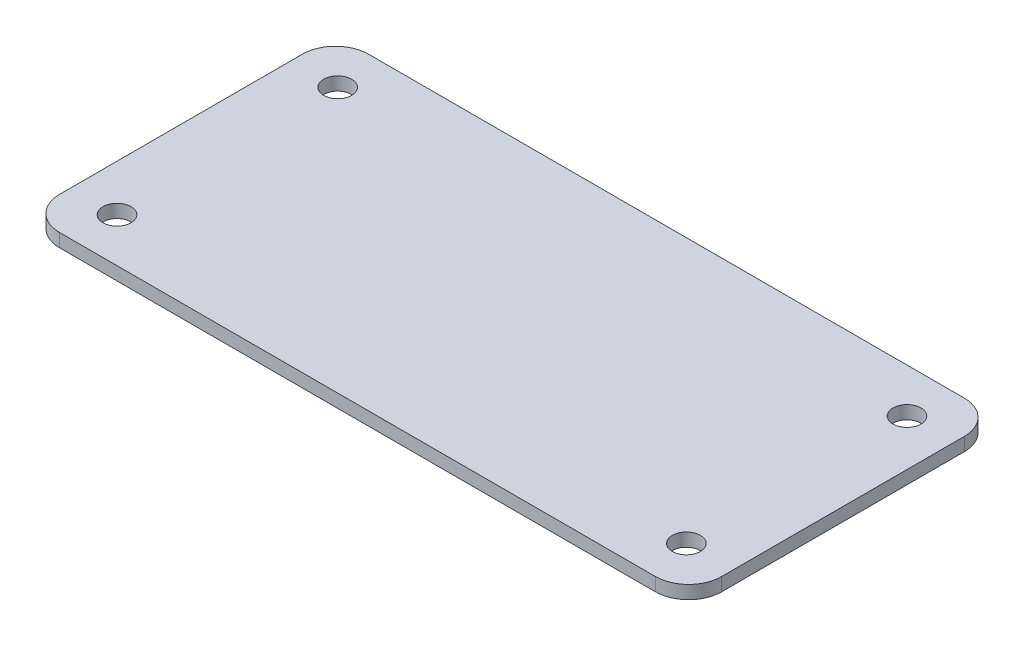
ISO-10303-21;
HEADER;
FILE_DESCRIPTION(('STEP AP214'),'2;1');
FILE_NAME('part.step','',(''),(''),'','','');
FILE_SCHEMA(('AUTOMOTIVE_DESIGN { 1 0 10303 214 1 1 1 1 }'));
ENDSEC;
DATA;
#1=APPLICATION_CONTEXT('core data for automotive mechanical design processes');
#2=APPLICATION_PROTOCOL_DEFINITION('international standard','automotive_design',2000,#1);
#3=PRODUCT_CONTEXT('',#1,'mechanical');
#4=PRODUCT('Part','Part','',(#3));
#5=PRODUCT_RELATED_PRODUCT_CATEGORY('part','',(#4));
#6=PRODUCT_DEFINITION_FORMATION('','',#4);
#7=PRODUCT_DEFINITION_CONTEXT('part definition',#1,'design');
#8=PRODUCT_DEFINITION('design','',#6,#7);
#9=PRODUCT_DEFINITION_SHAPE('','',#8);
#10=(LENGTH_UNIT() NAMED_UNIT(*) SI_UNIT(.MILLI.,.METRE.));
#11=(NAMED_UNIT(*) PLANE_ANGLE_UNIT() SI_UNIT($,.RADIAN.));
#12=(NAMED_UNIT(*) SI_UNIT($,.STERADIAN.) SOLID_ANGLE_UNIT());
#13=UNCERTAINTY_MEASURE_WITH_UNIT(LENGTH_MEASURE(1.E-05),#10,'distance_accuracy_value','');
#14=(GEOMETRIC_REPRESENTATION_CONTEXT(3) GLOBAL_UNCERTAINTY_ASSIGNED_CONTEXT((#13)) GLOBAL_UNIT_ASSIGNED_CONTEXT((#10,
#11,#12)) REPRESENTATION_CONTEXT('',''));
#15=CARTESIAN_POINT('',(0.,0.,0.));
#16=DIRECTION('',(0.,0.,1.));
#17=DIRECTION('',(1.,0.,0.));
#18=AXIS2_PLACEMENT_3D('',#15,#16,#17);
#19=CARTESIAN_POINT('',(0.,3.,0.));
#20=DIRECTION('',(1.,0.,0.));
#21=DIRECTION('',(0.,0.,-1.));
#22=AXIS2_PLACEMENT_3D('',#19,#20,#21);
#23=PLANE('',#22);
#24=DIRECTION('',(0.,0.,1.));
#25=VECTOR('',#24,1.);
#26=CARTESIAN_POINT('',(0.,0.,0.));
#27=LINE('',#26,#25);
#28=CARTESIAN_POINT('',(0.,0.,-62.5));
#29=VERTEX_POINT('',#28);
#30=CARTESIAN_POINT('',(0.,0.,-7.5));
#31=VERTEX_POINT('',#30);
#32=EDGE_CURVE('E126',#29,#31,#27,.T.);
#33=ORIENTED_EDGE('',*,*,#32,.T.);
#34=DIRECTION('',(0.,-1.,0.));
#35=VECTOR('',#34,1.);
#36=CARTESIAN_POINT('',(0.,3.,-7.5));
#37=LINE('',#36,#35);
#38=CARTESIAN_POINT('',(0.,3.,-7.5));
#39=VERTEX_POINT('',#38);
#40=EDGE_CURVE('E104',#31,#39,#37,.F.);
#41=ORIENTED_EDGE('',*,*,#40,.T.);
#42=DIRECTION('',(0.,0.,1.));
#43=VECTOR('',#42,1.);
#44=CARTESIAN_POINT('',(0.,3.,0.));
#45=LINE('',#44,#43);
#46=CARTESIAN_POINT('',(0.,3.,-62.5));
#47=VERTEX_POINT('',#46);
#48=EDGE_CURVE('E136',#47,#39,#45,.T.);
#49=ORIENTED_EDGE('',*,*,#48,.F.);
#50=DIRECTION('',(0.,-1.,0.));
#51=VECTOR('',#50,1.);
#52=CARTESIAN_POINT('',(0.,3.,-62.5));
#53=LINE('',#52,#51);
#54=EDGE_CURVE('E109',#47,#29,#53,.T.);
#55=ORIENTED_EDGE('',*,*,#54,.T.);
#56=EDGE_LOOP('',(#33,#41,#49,#55));
#57=FACE_BOUND('',#56,.T.);
#58=ADVANCED_FACE('F33',(#57),#23,.F.);
#59=CARTESIAN_POINT('',(0.,3.,0.));
#60=DIRECTION('',(0.,0.,-1.));
#61=DIRECTION('',(-1.,0.,0.));
#62=AXIS2_PLACEMENT_3D('',#59,#60,#61);
#63=PLANE('',#62);
#64=DIRECTION('',(1.,0.,0.));
#65=VECTOR('',#64,1.);
#66=CARTESIAN_POINT('',(0.,3.,0.));
#67=LINE('',#66,#65);
#68=CARTESIAN_POINT('',(7.5,3.,0.));
#69=VERTEX_POINT('',#68);
#70=CARTESIAN_POINT('',(142.5,3.,0.));
#71=VERTEX_POINT('',#70);
#72=EDGE_CURVE('E119',#69,#71,#67,.T.);
#73=ORIENTED_EDGE('',*,*,#72,.F.);
#74=DIRECTION('',(0.,-1.,0.));
#75=VECTOR('',#74,1.);
#76=CARTESIAN_POINT('',(7.5,3.,0.));
#77=LINE('',#76,#75);
#78=CARTESIAN_POINT('',(7.5,0.,0.));
#79=VERTEX_POINT('',#78);
#80=EDGE_CURVE('E103',#69,#79,#77,.T.);
#81=ORIENTED_EDGE('',*,*,#80,.T.);
#82=DIRECTION('',(1.,0.,0.));
#83=VECTOR('',#82,1.);
#84=CARTESIAN_POINT('',(0.,0.,0.));
#85=LINE('',#84,#83);
#86=CARTESIAN_POINT('',(142.5,0.,0.));
#87=VERTEX_POINT('',#86);
#88=EDGE_CURVE('E116',#79,#87,#85,.T.);
#89=ORIENTED_EDGE('',*,*,#88,.T.);
#90=DIRECTION('',(0.,-1.,0.));
#91=VECTOR('',#90,1.);
#92=CARTESIAN_POINT('',(142.5,3.,0.));
#93=LINE('',#92,#91);
#94=EDGE_CURVE('E121',#87,#71,#93,.F.);
#95=ORIENTED_EDGE('',*,*,#94,.T.);
#96=EDGE_LOOP('',(#73,#81,#89,#95));
#97=FACE_BOUND('',#96,.T.);
#98=ADVANCED_FACE('F115',(#97),#63,.F.);
#99=CARTESIAN_POINT('',(150.,3.,0.));
#100=DIRECTION('',(-1.,0.,0.));
#101=DIRECTION('',(0.,0.,1.));
#102=AXIS2_PLACEMENT_3D('',#99,#100,#101);
#103=PLANE('',#102);
#104=DIRECTION('',(0.,0.,-1.));
#105=VECTOR('',#104,1.);
#106=CARTESIAN_POINT('',(150.,3.,0.));
#107=LINE('',#106,#105);
#108=CARTESIAN_POINT('',(150.,3.,-7.5));
#109=VERTEX_POINT('',#108);
#110=CARTESIAN_POINT('',(150.,3.,-62.5));
#111=VERTEX_POINT('',#110);
#112=EDGE_CURVE('E162',#109,#111,#107,.T.);
#113=ORIENTED_EDGE('',*,*,#112,.F.);
#114=DIRECTION('',(0.,-1.,0.));
#115=VECTOR('',#114,1.);
#116=CARTESIAN_POINT('',(150.,3.,-7.5));
#117=LINE('',#116,#115);
#118=CARTESIAN_POINT('',(150.,0.,-7.5));
#119=VERTEX_POINT('',#118);
#120=EDGE_CURVE('E155',#109,#119,#117,.T.);
#121=ORIENTED_EDGE('',*,*,#120,.T.);
#122=DIRECTION('',(0.,0.,-1.));
#123=VECTOR('',#122,1.);
#124=CARTESIAN_POINT('',(150.,0.,0.));
#125=LINE('',#124,#123);
#126=CARTESIAN_POINT('',(150.,0.,-62.5));
#127=VERTEX_POINT('',#126);
#128=EDGE_CURVE('E125',#119,#127,#125,.T.);
#129=ORIENTED_EDGE('',*,*,#128,.T.);
#130=DIRECTION('',(0.,-1.,0.));
#131=VECTOR('',#130,1.);
#132=CARTESIAN_POINT('',(150.,3.,-62.5));
#133=LINE('',#132,#131);
#134=EDGE_CURVE('E153',#127,#111,#133,.F.);
#135=ORIENTED_EDGE('',*,*,#134,.T.);
#136=EDGE_LOOP('',(#113,#121,#129,#135));
#137=FACE_BOUND('',#136,.T.);
#138=ADVANCED_FACE('F160',(#137),#103,.F.);
#139=CARTESIAN_POINT('',(0.,3.,-70.));
#140=DIRECTION('',(0.,0.,1.));
#141=DIRECTION('',(1.,0.,0.));
#142=AXIS2_PLACEMENT_3D('',#139,#140,#141);
#143=PLANE('',#142);
#144=DIRECTION('',(-1.,0.,0.));
#145=VECTOR('',#144,1.);
#146=CARTESIAN_POINT('',(0.,3.,-70.));
#147=LINE('',#146,#145);
#148=CARTESIAN_POINT('',(142.5,3.,-70.));
#149=VERTEX_POINT('',#148);
#150=CARTESIAN_POINT('',(7.5,3.,-70.));
#151=VERTEX_POINT('',#150);
#152=EDGE_CURVE('E137',#149,#151,#147,.T.);
#153=ORIENTED_EDGE('',*,*,#152,.F.);
#154=DIRECTION('',(0.,-1.,0.));
#155=VECTOR('',#154,1.);
#156=CARTESIAN_POINT('',(142.5,3.,-70.));
#157=LINE('',#156,#155);
#158=CARTESIAN_POINT('',(142.5,0.,-70.));
#159=VERTEX_POINT('',#158);
#160=EDGE_CURVE('E11',#149,#159,#157,.T.);
#161=ORIENTED_EDGE('',*,*,#160,.T.);
#162=DIRECTION('',(-1.,0.,0.));
#163=VECTOR('',#162,1.);
#164=CARTESIAN_POINT('',(0.,0.,-70.));
#165=LINE('',#164,#163);
#166=CARTESIAN_POINT('',(7.5,0.,-70.));
#167=VERTEX_POINT('',#166);
#168=EDGE_CURVE('E129',#159,#167,#165,.T.);
#169=ORIENTED_EDGE('',*,*,#168,.T.);
#170=DIRECTION('',(0.,-1.,0.));
#171=VECTOR('',#170,1.);
#172=CARTESIAN_POINT('',(7.5,3.,-70.));
#173=LINE('',#172,#171);
#174=EDGE_CURVE('E41',#167,#151,#173,.F.);
#175=ORIENTED_EDGE('',*,*,#174,.T.);
#176=EDGE_LOOP('',(#153,#161,#169,#175));
#177=FACE_BOUND('',#176,.T.);
#178=ADVANCED_FACE('F169',(#177),#143,.F.);
#179=CARTESIAN_POINT('',(0.,3.,0.));
#180=DIRECTION('',(0.,-1.,0.));
#181=DIRECTION('',(0.,0.,-1.));
#182=AXIS2_PLACEMENT_3D('',#179,#180,#181);
#183=PLANE('',#182);
#184=CARTESIAN_POINT('',(139.500000000001,3.,-10.));
#185=DIRECTION('',(0.,1.,0.));
#186=DIRECTION('',(0.,0.,1.));
#187=AXIS2_PLACEMENT_3D('',#184,#185,#186);
#188=CIRCLE('',#187,3.175);
#189=CARTESIAN_POINT('',(139.500000000001,3.,-6.825));
#190=VERTEX_POINT('',#189);
#191=EDGE_CURVE('E194',#190,#190,#188,.T.);
#192=ORIENTED_EDGE('',*,*,#191,.F.);
#193=EDGE_LOOP('',(#192));
#194=FACE_BOUND('',#193,.T.);
#195=CARTESIAN_POINT('',(139.5,3.,-60.));
#196=DIRECTION('',(0.,1.,0.));
#197=DIRECTION('',(0.,0.,1.));
#198=AXIS2_PLACEMENT_3D('',#195,#196,#197);
#199=CIRCLE('',#198,3.175);
#200=CARTESIAN_POINT('',(139.5,3.,-56.825));
#201=VERTEX_POINT('',#200);
#202=EDGE_CURVE('E188',#201,#201,#199,.T.);
#203=ORIENTED_EDGE('',*,*,#202,.F.);
#204=EDGE_LOOP('',(#203));
#205=FACE_BOUND('',#204,.T.);
#206=CARTESIAN_POINT('',(10.5000000000007,3.,-10.));
#207=DIRECTION('',(0.,1.,0.));
#208=DIRECTION('',(0.,0.,1.));
#209=AXIS2_PLACEMENT_3D('',#206,#207,#208);
#210=CIRCLE('',#209,3.175);
#211=CARTESIAN_POINT('',(10.5000000000007,3.,-6.825));
#212=VERTEX_POINT('',#211);
#213=EDGE_CURVE('E182',#212,#212,#210,.T.);
#214=ORIENTED_EDGE('',*,*,#213,.F.);
#215=EDGE_LOOP('',(#214));
#216=FACE_BOUND('',#215,.T.);
#217=CARTESIAN_POINT('',(10.5,3.,-60.));
#218=DIRECTION('',(0.,1.,0.));
#219=DIRECTION('',(0.,0.,1.));
#220=AXIS2_PLACEMENT_3D('',#217,#218,#219);
#221=CIRCLE('',#220,3.175);
#222=CARTESIAN_POINT('',(10.5,3.,-56.825));
#223=VERTEX_POINT('',#222);
#224=EDGE_CURVE('E176',#223,#223,#221,.T.);
#225=ORIENTED_EDGE('',*,*,#224,.F.);
#226=EDGE_LOOP('',(#225));
#227=FACE_BOUND('',#226,.T.);
#228=ORIENTED_EDGE('',*,*,#48,.T.);
#229=CARTESIAN_POINT('',(7.5,3.,-7.5));
#230=DIRECTION('',(0.,-1.,0.));
#231=DIRECTION('',(0.,0.,-1.));
#232=AXIS2_PLACEMENT_3D('',#229,#230,#231);
#233=CIRCLE('',#232,7.5);
#234=EDGE_CURVE('E151',#39,#69,#233,.F.);
#235=ORIENTED_EDGE('',*,*,#234,.T.);
#236=ORIENTED_EDGE('',*,*,#72,.T.);
#237=CARTESIAN_POINT('',(142.5,3.,-7.5));
#238=DIRECTION('',(0.,-1.,0.));
#239=DIRECTION('',(0.,0.,-1.));
#240=AXIS2_PLACEMENT_3D('',#237,#238,#239);
#241=CIRCLE('',#240,7.5);
#242=EDGE_CURVE('E149',#71,#109,#241,.F.);
#243=ORIENTED_EDGE('',*,*,#242,.T.);
#244=ORIENTED_EDGE('',*,*,#112,.T.);
#245=CARTESIAN_POINT('',(142.5,3.,-62.5));
#246=DIRECTION('',(0.,-1.,0.));
#247=DIRECTION('',(0.,0.,-1.));
#248=AXIS2_PLACEMENT_3D('',#245,#246,#247);
#249=CIRCLE('',#248,7.5);
#250=EDGE_CURVE('E54',#111,#149,#249,.F.);
#251=ORIENTED_EDGE('',*,*,#250,.T.);
#252=ORIENTED_EDGE('',*,*,#152,.T.);
#253=CARTESIAN_POINT('',(7.5,3.,-62.5));
#254=DIRECTION('',(0.,-1.,0.));
#255=DIRECTION('',(0.,0.,-1.));
#256=AXIS2_PLACEMENT_3D('',#253,#254,#255);
#257=CIRCLE('',#256,7.5);
#258=EDGE_CURVE('E146',#151,#47,#257,.F.);
#259=ORIENTED_EDGE('',*,*,#258,.T.);
#260=EDGE_LOOP('',(#228,#235,#236,#243,#244,#251,#252,#259));
#261=FACE_BOUND('',#260,.T.);
#262=ADVANCED_FACE('F209',(#194,#205,#216,#227,#261),#183,.F.);
#263=CARTESIAN_POINT('',(0.,0.,0.));
#264=DIRECTION('',(0.,-1.,0.));
#265=DIRECTION('',(0.,0.,-1.));
#266=AXIS2_PLACEMENT_3D('',#263,#264,#265);
#267=PLANE('',#266);
#268=CARTESIAN_POINT('',(139.500000000001,0.,-10.));
#269=DIRECTION('',(0.,1.,0.));
#270=DIRECTION('',(0.,0.,1.));
#271=AXIS2_PLACEMENT_3D('',#268,#269,#270);
#272=CIRCLE('',#271,3.175);
#273=CARTESIAN_POINT('',(139.500000000001,0.,-6.825));
#274=VERTEX_POINT('',#273);
#275=EDGE_CURVE('E191',#274,#274,#272,.T.);
#276=ORIENTED_EDGE('',*,*,#275,.T.);
#277=EDGE_LOOP('',(#276));
#278=FACE_BOUND('',#277,.T.);
#279=CARTESIAN_POINT('',(139.5,0.,-60.));
#280=DIRECTION('',(0.,1.,0.));
#281=DIRECTION('',(0.,0.,1.));
#282=AXIS2_PLACEMENT_3D('',#279,#280,#281);
#283=CIRCLE('',#282,3.175);
#284=CARTESIAN_POINT('',(139.5,0.,-56.825));
#285=VERTEX_POINT('',#284);
#286=EDGE_CURVE('E185',#285,#285,#283,.T.);
#287=ORIENTED_EDGE('',*,*,#286,.T.);
#288=EDGE_LOOP('',(#287));
#289=FACE_BOUND('',#288,.T.);
#290=CARTESIAN_POINT('',(10.5000000000007,0.,-10.));
#291=DIRECTION('',(0.,1.,0.));
#292=DIRECTION('',(0.,0.,1.));
#293=AXIS2_PLACEMENT_3D('',#290,#291,#292);
#294=CIRCLE('',#293,3.175);
#295=CARTESIAN_POINT('',(10.5000000000007,0.,-6.825));
#296=VERTEX_POINT('',#295);
#297=EDGE_CURVE('E179',#296,#296,#294,.T.);
#298=ORIENTED_EDGE('',*,*,#297,.T.);
#299=EDGE_LOOP('',(#298));
#300=FACE_BOUND('',#299,.T.);
#301=CARTESIAN_POINT('',(10.5,0.,-60.));
#302=DIRECTION('',(0.,1.,0.));
#303=DIRECTION('',(0.,0.,1.));
#304=AXIS2_PLACEMENT_3D('',#301,#302,#303);
#305=CIRCLE('',#304,3.175);
#306=CARTESIAN_POINT('',(10.5,0.,-56.825));
#307=VERTEX_POINT('',#306);
#308=EDGE_CURVE('E131',#307,#307,#305,.T.);
#309=ORIENTED_EDGE('',*,*,#308,.T.);
#310=EDGE_LOOP('',(#309));
#311=FACE_BOUND('',#310,.T.);
#312=ORIENTED_EDGE('',*,*,#88,.F.);
#313=CARTESIAN_POINT('',(7.5,0.,-7.5));
#314=DIRECTION('',(0.,-1.,0.));
#315=DIRECTION('',(0.,0.,-1.));
#316=AXIS2_PLACEMENT_3D('',#313,#314,#315);
#317=CIRCLE('',#316,7.5);
#318=EDGE_CURVE('E99',#79,#31,#317,.T.);
#319=ORIENTED_EDGE('',*,*,#318,.T.);
#320=ORIENTED_EDGE('',*,*,#32,.F.);
#321=CARTESIAN_POINT('',(7.5,0.,-62.5));
#322=DIRECTION('',(0.,-1.,0.));
#323=DIRECTION('',(0.,0.,-1.));
#324=AXIS2_PLACEMENT_3D('',#321,#322,#323);
#325=CIRCLE('',#324,7.5);
#326=EDGE_CURVE('E120',#29,#167,#325,.T.);
#327=ORIENTED_EDGE('',*,*,#326,.T.);
#328=ORIENTED_EDGE('',*,*,#168,.F.);
#329=CARTESIAN_POINT('',(142.5,0.,-62.5));
#330=DIRECTION('',(0.,-1.,0.));
#331=DIRECTION('',(0.,0.,-1.));
#332=AXIS2_PLACEMENT_3D('',#329,#330,#331);
#333=CIRCLE('',#332,7.5);
#334=EDGE_CURVE('E140',#159,#127,#333,.T.);
#335=ORIENTED_EDGE('',*,*,#334,.T.);
#336=ORIENTED_EDGE('',*,*,#128,.F.);
#337=CARTESIAN_POINT('',(142.5,0.,-7.5));
#338=DIRECTION('',(0.,-1.,0.));
#339=DIRECTION('',(0.,0.,-1.));
#340=AXIS2_PLACEMENT_3D('',#337,#338,#339);
#341=CIRCLE('',#340,7.5);
#342=EDGE_CURVE('E110',#119,#87,#341,.T.);
#343=ORIENTED_EDGE('',*,*,#342,.T.);
#344=EDGE_LOOP('',(#312,#319,#320,#327,#328,#335,#336,#343));
#345=FACE_BOUND('',#344,.T.);
#346=ADVANCED_FACE('F123',(#278,#289,#300,#311,#345),#267,.T.);
#347=CARTESIAN_POINT('',(10.5,0.,-60.));
#348=DIRECTION('',(0.,1.,0.));
#349=DIRECTION('',(0.,0.,1.));
#350=AXIS2_PLACEMENT_3D('',#347,#348,#349);
#351=CYLINDRICAL_SURFACE('',#350,3.175);
#352=ORIENTED_EDGE('',*,*,#308,.F.);
#353=EDGE_LOOP('',(#352));
#354=FACE_BOUND('',#353,.T.);
#355=ORIENTED_EDGE('',*,*,#224,.T.);
#356=EDGE_LOOP('',(#355));
#357=FACE_BOUND('',#356,.T.);
#358=ADVANCED_FACE('F281',(#354,#357),#351,.F.);
#359=CARTESIAN_POINT('',(10.5000000000007,0.,-10.));
#360=DIRECTION('',(0.,1.,0.));
#361=DIRECTION('',(0.,0.,1.));
#362=AXIS2_PLACEMENT_3D('',#359,#360,#361);
#363=CYLINDRICAL_SURFACE('',#362,3.175);
#364=ORIENTED_EDGE('',*,*,#297,.F.);
#365=EDGE_LOOP('',(#364));
#366=FACE_BOUND('',#365,.T.);
#367=ORIENTED_EDGE('',*,*,#213,.T.);
#368=EDGE_LOOP('',(#367));
#369=FACE_BOUND('',#368,.T.);
#370=ADVANCED_FACE('F272',(#366,#369),#363,.F.);
#371=CARTESIAN_POINT('',(139.5,0.,-60.));
#372=DIRECTION('',(0.,1.,0.));
#373=DIRECTION('',(0.,0.,1.));
#374=AXIS2_PLACEMENT_3D('',#371,#372,#373);
#375=CYLINDRICAL_SURFACE('',#374,3.175);
#376=ORIENTED_EDGE('',*,*,#286,.F.);
#377=EDGE_LOOP('',(#376));
#378=FACE_BOUND('',#377,.T.);
#379=ORIENTED_EDGE('',*,*,#202,.T.);
#380=EDGE_LOOP('',(#379));
#381=FACE_BOUND('',#380,.T.);
#382=ADVANCED_FACE('F205',(#378,#381),#375,.F.);
#383=CARTESIAN_POINT('',(139.500000000001,0.,-10.));
#384=DIRECTION('',(0.,1.,0.));
#385=DIRECTION('',(0.,0.,1.));
#386=AXIS2_PLACEMENT_3D('',#383,#384,#385);
#387=CYLINDRICAL_SURFACE('',#386,3.175);
#388=ORIENTED_EDGE('',*,*,#275,.F.);
#389=EDGE_LOOP('',(#388));
#390=FACE_BOUND('',#389,.T.);
#391=ORIENTED_EDGE('',*,*,#191,.T.);
#392=EDGE_LOOP('',(#391));
#393=FACE_BOUND('',#392,.T.);
#394=ADVANCED_FACE('F202',(#390,#393),#387,.F.);
#395=CARTESIAN_POINT('',(7.5,3.,-7.5));
#396=DIRECTION('',(0.,-1.,0.));
#397=DIRECTION('',(0.,0.,-1.));
#398=AXIS2_PLACEMENT_3D('',#395,#396,#397);
#399=CYLINDRICAL_SURFACE('',#398,7.5);
#400=ORIENTED_EDGE('',*,*,#234,.F.);
#401=ORIENTED_EDGE('',*,*,#40,.F.);
#402=ORIENTED_EDGE('',*,*,#318,.F.);
#403=ORIENTED_EDGE('',*,*,#80,.F.);
#404=EDGE_LOOP('',(#400,#401,#402,#403));
#405=FACE_BOUND('',#404,.T.);
#406=ADVANCED_FACE('F102',(#405),#399,.T.);
#407=CARTESIAN_POINT('',(142.5,3.,-7.5));
#408=DIRECTION('',(0.,-1.,0.));
#409=DIRECTION('',(0.,0.,-1.));
#410=AXIS2_PLACEMENT_3D('',#407,#408,#409);
#411=CYLINDRICAL_SURFACE('',#410,7.5);
#412=ORIENTED_EDGE('',*,*,#242,.F.);
#413=ORIENTED_EDGE('',*,*,#94,.F.);
#414=ORIENTED_EDGE('',*,*,#342,.F.);
#415=ORIENTED_EDGE('',*,*,#120,.F.);
#416=EDGE_LOOP('',(#412,#413,#414,#415));
#417=FACE_BOUND('',#416,.T.);
#418=ADVANCED_FACE('F226',(#417),#411,.T.);
#419=CARTESIAN_POINT('',(142.5,3.,-62.5));
#420=DIRECTION('',(0.,-1.,0.));
#421=DIRECTION('',(0.,0.,-1.));
#422=AXIS2_PLACEMENT_3D('',#419,#420,#421);
#423=CYLINDRICAL_SURFACE('',#422,7.5);
#424=ORIENTED_EDGE('',*,*,#250,.F.);
#425=ORIENTED_EDGE('',*,*,#134,.F.);
#426=ORIENTED_EDGE('',*,*,#334,.F.);
#427=ORIENTED_EDGE('',*,*,#160,.F.);
#428=EDGE_LOOP('',(#424,#425,#426,#427));
#429=FACE_BOUND('',#428,.T.);
#430=ADVANCED_FACE('F168',(#429),#423,.T.);
#431=CARTESIAN_POINT('',(7.5,3.,-62.5));
#432=DIRECTION('',(0.,-1.,0.));
#433=DIRECTION('',(0.,0.,-1.));
#434=AXIS2_PLACEMENT_3D('',#431,#432,#433);
#435=CYLINDRICAL_SURFACE('',#434,7.5);
#436=ORIENTED_EDGE('',*,*,#258,.F.);
#437=ORIENTED_EDGE('',*,*,#174,.F.);
#438=ORIENTED_EDGE('',*,*,#326,.F.);
#439=ORIENTED_EDGE('',*,*,#54,.F.);
#440=EDGE_LOOP('',(#436,#437,#438,#439));
#441=FACE_BOUND('',#440,.T.);
#442=ADVANCED_FACE('F35',(#441),#435,.T.);
#443=CLOSED_SHELL('',(#58,#98,#138,#178,#262,#346,#358,#370,#382,#394,#406,#418,#430,#442));
#444=MANIFOLD_SOLID_BREP('B2',#443);
#445=ADVANCED_BREP_SHAPE_REPRESENTATION('',(#18,#444),#14);
#446=SHAPE_DEFINITION_REPRESENTATION(#9,#445);
ENDSEC;
END-ISO-10303-21;
